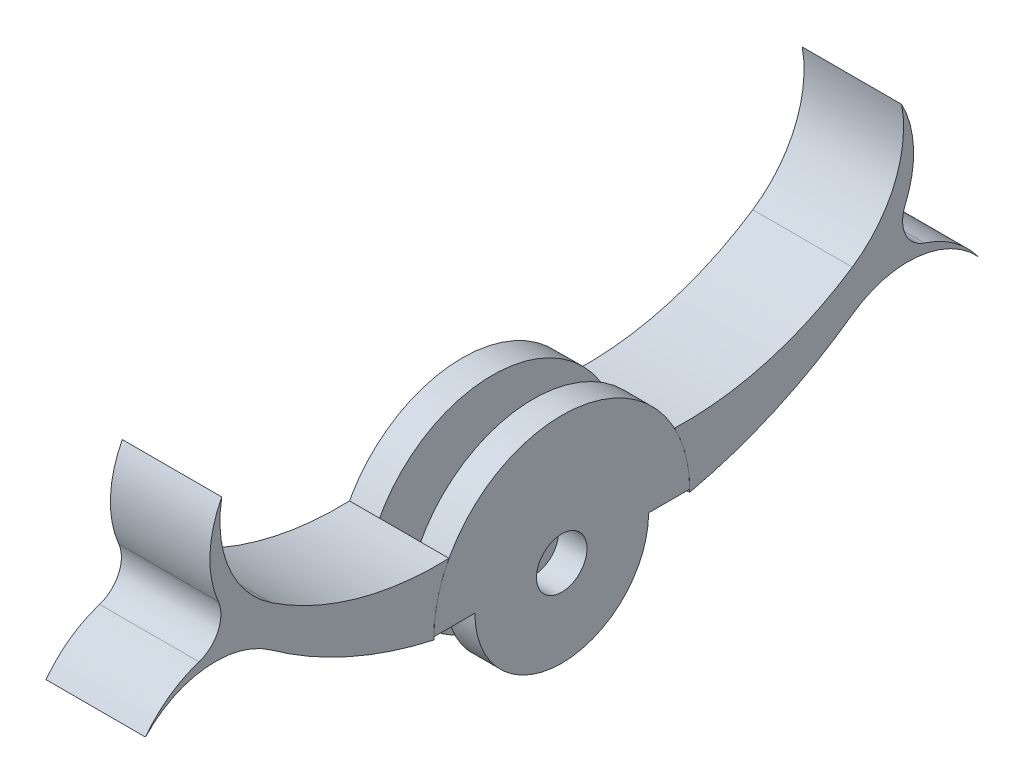
ISO-10303-21;
HEADER;
FILE_DESCRIPTION(('STEP AP214'),'2;1');
FILE_NAME('part.step','',(''),(''),'','','');
FILE_SCHEMA(('AUTOMOTIVE_DESIGN { 1 0 10303 214 1 1 1 1 }'));
ENDSEC;
DATA;
#1=APPLICATION_CONTEXT('core data for automotive mechanical design processes');
#2=APPLICATION_PROTOCOL_DEFINITION('international standard','automotive_design',2000,#1);
#3=PRODUCT_CONTEXT('',#1,'mechanical');
#4=PRODUCT('Part','Part','',(#3));
#5=PRODUCT_RELATED_PRODUCT_CATEGORY('part','',(#4));
#6=PRODUCT_DEFINITION_FORMATION('','',#4);
#7=PRODUCT_DEFINITION_CONTEXT('part definition',#1,'design');
#8=PRODUCT_DEFINITION('design','',#6,#7);
#9=PRODUCT_DEFINITION_SHAPE('','',#8);
#10=(LENGTH_UNIT() NAMED_UNIT(*) SI_UNIT(.MILLI.,.METRE.));
#11=(NAMED_UNIT(*) PLANE_ANGLE_UNIT() SI_UNIT($,.RADIAN.));
#12=(NAMED_UNIT(*) SI_UNIT($,.STERADIAN.) SOLID_ANGLE_UNIT());
#13=UNCERTAINTY_MEASURE_WITH_UNIT(LENGTH_MEASURE(1.E-05),#10,'distance_accuracy_value','');
#14=(GEOMETRIC_REPRESENTATION_CONTEXT(3) GLOBAL_UNCERTAINTY_ASSIGNED_CONTEXT((#13)) GLOBAL_UNIT_ASSIGNED_CONTEXT((#10,
#11,#12)) REPRESENTATION_CONTEXT('',''));
#15=CARTESIAN_POINT('',(0.,0.,0.));
#16=DIRECTION('',(0.,0.,1.));
#17=DIRECTION('',(1.,0.,0.));
#18=AXIS2_PLACEMENT_3D('',#15,#16,#17);
#19=CARTESIAN_POINT('',(8.001,0.,0.));
#20=DIRECTION('',(1.,0.,0.));
#21=DIRECTION('',(0.,0.,1.));
#22=AXIS2_PLACEMENT_3D('',#19,#20,#21);
#23=PLANE('',#22);
#24=CARTESIAN_POINT('',(8.001,34.5934679798672,-2.58194272139042));
#25=DIRECTION('',(-1.,0.,0.));
#26=DIRECTION('',(0.,0.,1.));
#27=AXIS2_PLACEMENT_3D('',#24,#25,#26);
#28=CIRCLE('',#27,35.6553535156911);
#29=CARTESIAN_POINT('',(8.001,-0.219928201198768,-10.2846487828373));
#30=VERTEX_POINT('',#29);
#31=CARTESIAN_POINT('',(8.001,5.62207179880123,-23.3656487828373));
#32=VERTEX_POINT('',#31);
#33=EDGE_CURVE('E51',#30,#32,#28,.F.);
#34=ORIENTED_EDGE('',*,*,#33,.T.);
#35=CARTESIAN_POINT('',(8.001,-0.627053130674843,-27.848690430667));
#36=DIRECTION('',(-1.,0.,0.));
#37=DIRECTION('',(0.,0.,1.));
#38=AXIS2_PLACEMENT_3D('',#35,#36,#37);
#39=CIRCLE('',#38,7.69085332069039);
#40=CARTESIAN_POINT('',(8.001,4.61567464330049,-33.475681659411));
#41=VERTEX_POINT('',#40);
#42=EDGE_CURVE('E114',#32,#41,#39,.T.);
#43=ORIENTED_EDGE('',*,*,#42,.T.);
#44=CARTESIAN_POINT('',(8.001,-0.558812525632776,-26.5026890564416));
#45=DIRECTION('',(-1.,0.,0.));
#46=DIRECTION('',(0.,0.,1.));
#47=AXIS2_PLACEMENT_3D('',#44,#45,#46);
#48=CIRCLE('',#47,8.68319890953337);
#49=CARTESIAN_POINT('',(8.001,7.70415506120035,-29.1712673223852));
#50=VERTEX_POINT('',#49);
#51=EDGE_CURVE('E112',#41,#50,#48,.F.);
#52=ORIENTED_EDGE('',*,*,#51,.T.);
#53=CARTESIAN_POINT('',(8.001,10.1212294469447,-29.9518769647665));
#54=DIRECTION('',(-1.,0.,0.));
#55=DIRECTION('',(0.,0.,1.));
#56=AXIS2_PLACEMENT_3D('',#53,#54,#55);
#57=CIRCLE('',#56,2.54);
#58=CARTESIAN_POINT('',(8.001,11.1275475547437,-27.6197269125795));
#59=VERTEX_POINT('',#58);
#60=EDGE_CURVE('E151',#50,#59,#57,.T.);
#61=ORIENTED_EDGE('',*,*,#60,.T.);
#62=CARTESIAN_POINT('',(8.001,14.4101946702873,-20.0121666565386));
#63=DIRECTION('',(-1.,0.,0.));
#64=DIRECTION('',(0.,0.,1.));
#65=AXIS2_PLACEMENT_3D('',#62,#63,#64);
#66=CIRCLE('',#65,8.28557452048316);
#67=CARTESIAN_POINT('',(8.001,18.2736984419772,-27.3418381185222));
#68=VERTEX_POINT('',#67);
#69=EDGE_CURVE('E147',#59,#68,#66,.F.);
#70=ORIENTED_EDGE('',*,*,#69,.T.);
#71=CARTESIAN_POINT('',(8.001,16.6298694438391,-18.2266754483472));
#72=DIRECTION('',(-1.,0.,0.));
#73=DIRECTION('',(0.,0.,1.));
#74=AXIS2_PLACEMENT_3D('',#71,#72,#73);
#75=CIRCLE('',#74,9.26220083343437);
#76=CARTESIAN_POINT('',(8.001,8.92407179880123,-23.3656487828373));
#77=VERTEX_POINT('',#76);
#78=EDGE_CURVE('E143',#68,#77,#75,.T.);
#79=ORIENTED_EDGE('',*,*,#78,.T.);
#80=CARTESIAN_POINT('',(8.001,29.115893095207,-9.89978372942019));
#81=DIRECTION('',(-1.,0.,0.));
#82=DIRECTION('',(0.,0.,1.));
#83=AXIS2_PLACEMENT_3D('',#80,#81,#82);
#84=CIRCLE('',#83,24.27012914887);
#85=CARTESIAN_POINT('',(8.001,4.86007179880123,-9.06653578333517));
#86=VERTEX_POINT('',#85);
#87=EDGE_CURVE('E139',#77,#86,#84,.T.);
#88=ORIENTED_EDGE('',*,*,#87,.T.);
#89=CARTESIAN_POINT('',(8.001,-9.88358700437786E-13,4.13384604325273E-12));
#90=DIRECTION('',(-1.,0.,0.));
#91=DIRECTION('',(0.,0.,1.));
#92=AXIS2_PLACEMENT_3D('',#89,#90,#91);
#93=CIRCLE('',#92,10.2870000000041);
#94=EDGE_CURVE('E136',#86,#30,#93,.T.);
#95=ORIENTED_EDGE('',*,*,#94,.T.);
#96=EDGE_LOOP('',(#34,#43,#52,#61,#70,#79,#88,#95));
#97=FACE_BOUND('',#96,.T.);
#98=ADVANCED_FACE('F43',(#97),#23,.T.);
#99=CARTESIAN_POINT('',(0.,16.9832074245962,-15.2153165760287));
#100=DIRECTION('',(-1.,0.,0.));
#101=DIRECTION('',(0.,0.,-1.));
#102=AXIS2_PLACEMENT_3D('',#99,#100,#101);
#103=PLANE('',#102);
#104=CARTESIAN_POINT('',(0.,34.5934679798672,-2.58194272139042));
#105=DIRECTION('',(1.,0.,0.));
#106=DIRECTION('',(0.,0.,-1.));
#107=AXIS2_PLACEMENT_3D('',#104,#105,#106);
#108=CIRCLE('',#107,35.6553535156911);
#109=CARTESIAN_POINT('',(0.,-0.219928201198768,-10.2846487828373));
#110=VERTEX_POINT('',#109);
#111=CARTESIAN_POINT('',(0.,5.62207179880123,-23.3656487828373));
#112=VERTEX_POINT('',#111);
#113=EDGE_CURVE('E120',#110,#112,#108,.T.);
#114=ORIENTED_EDGE('',*,*,#113,.F.);
#115=CARTESIAN_POINT('',(0.,-9.88358700437786E-13,4.13384604325273E-12));
#116=DIRECTION('',(-1.,0.,0.));
#117=DIRECTION('',(0.,0.,1.));
#118=AXIS2_PLACEMENT_3D('',#115,#116,#117);
#119=CIRCLE('',#118,10.2870000000041);
#120=CARTESIAN_POINT('',(0.,4.86007179880123,-9.06653578333517));
#121=VERTEX_POINT('',#120);
#122=EDGE_CURVE('E132',#121,#110,#119,.T.);
#123=ORIENTED_EDGE('',*,*,#122,.F.);
#124=CARTESIAN_POINT('',(0.,29.115893095207,-9.89978372942019));
#125=DIRECTION('',(-1.,0.,0.));
#126=DIRECTION('',(0.,0.,-1.));
#127=AXIS2_PLACEMENT_3D('',#124,#125,#126);
#128=CIRCLE('',#127,24.27012914887);
#129=CARTESIAN_POINT('',(0.,8.92407179880123,-23.3656487828373));
#130=VERTEX_POINT('',#129);
#131=EDGE_CURVE('E170',#130,#121,#128,.T.);
#132=ORIENTED_EDGE('',*,*,#131,.F.);
#133=CARTESIAN_POINT('',(0.,16.6298694438391,-18.2266754483472));
#134=DIRECTION('',(-1.,0.,0.));
#135=DIRECTION('',(0.,0.,-1.));
#136=AXIS2_PLACEMENT_3D('',#133,#134,#135);
#137=CIRCLE('',#136,9.26220083343437);
#138=CARTESIAN_POINT('',(0.,18.2736984419772,-27.3418381185222));
#139=VERTEX_POINT('',#138);
#140=EDGE_CURVE('E169',#139,#130,#137,.T.);
#141=ORIENTED_EDGE('',*,*,#140,.F.);
#142=CARTESIAN_POINT('',(0.,14.4101946702873,-20.0121666565386));
#143=DIRECTION('',(1.,0.,0.));
#144=DIRECTION('',(0.,0.,1.));
#145=AXIS2_PLACEMENT_3D('',#142,#143,#144);
#146=CIRCLE('',#145,8.28557452048316);
#147=CARTESIAN_POINT('',(0.,11.1275475547437,-27.6197269125795));
#148=VERTEX_POINT('',#147);
#149=EDGE_CURVE('E126',#148,#139,#146,.T.);
#150=ORIENTED_EDGE('',*,*,#149,.F.);
#151=CARTESIAN_POINT('',(0.,10.1212294469447,-29.9518769647665));
#152=DIRECTION('',(-1.,0.,0.));
#153=DIRECTION('',(0.,0.,-1.));
#154=AXIS2_PLACEMENT_3D('',#151,#152,#153);
#155=CIRCLE('',#154,2.54);
#156=CARTESIAN_POINT('',(0.,7.70415506120035,-29.1712673223852));
#157=VERTEX_POINT('',#156);
#158=EDGE_CURVE('E124',#157,#148,#155,.T.);
#159=ORIENTED_EDGE('',*,*,#158,.F.);
#160=CARTESIAN_POINT('',(0.,-0.558812525632776,-26.5026890564416));
#161=DIRECTION('',(1.,0.,0.));
#162=DIRECTION('',(0.,0.,-1.));
#163=AXIS2_PLACEMENT_3D('',#160,#161,#162);
#164=CIRCLE('',#163,8.68319890953337);
#165=CARTESIAN_POINT('',(0.,4.61567464330049,-33.475681659411));
#166=VERTEX_POINT('',#165);
#167=EDGE_CURVE('E109',#166,#157,#164,.T.);
#168=ORIENTED_EDGE('',*,*,#167,.F.);
#169=CARTESIAN_POINT('',(0.,-0.627053130674843,-27.848690430667));
#170=DIRECTION('',(-1.,0.,0.));
#171=DIRECTION('',(0.,0.,1.));
#172=AXIS2_PLACEMENT_3D('',#169,#170,#171);
#173=CIRCLE('',#172,7.69085332069039);
#174=EDGE_CURVE('E115',#112,#166,#173,.T.);
#175=ORIENTED_EDGE('',*,*,#174,.F.);
#176=EDGE_LOOP('',(#114,#123,#132,#141,#150,#159,#168,#175));
#177=FACE_BOUND('',#176,.T.);
#178=ADVANCED_FACE('F122',(#177),#103,.T.);
#179=CARTESIAN_POINT('',(38.6248571838483,-0.627053130674843,-27.848690430667));
#180=DIRECTION('',(-1.,0.,0.));
#181=DIRECTION('',(0.,0.,-1.));
#182=AXIS2_PLACEMENT_3D('',#179,#180,#181);
#183=CYLINDRICAL_SURFACE('',#182,7.69085332069039);
#184=DIRECTION('',(-1.,0.,0.));
#185=VECTOR('',#184,1.);
#186=CARTESIAN_POINT('',(38.6248571838483,5.62207179880123,-23.3656487828373));
#187=LINE('',#186,#185);
#188=EDGE_CURVE('E12',#32,#112,#187,.T.);
#189=ORIENTED_EDGE('',*,*,#188,.T.);
#190=ORIENTED_EDGE('',*,*,#174,.T.);
#191=DIRECTION('',(-1.,0.,0.));
#192=VECTOR('',#191,1.);
#193=CARTESIAN_POINT('',(38.6248571838483,4.61567464330049,-33.475681659411));
#194=LINE('',#193,#192);
#195=EDGE_CURVE('E92',#41,#166,#194,.T.);
#196=ORIENTED_EDGE('',*,*,#195,.F.);
#197=ORIENTED_EDGE('',*,*,#42,.F.);
#198=EDGE_LOOP('',(#189,#190,#196,#197));
#199=FACE_BOUND('',#198,.T.);
#200=ADVANCED_FACE('F116',(#199),#183,.F.);
#201=CARTESIAN_POINT('',(38.6248571838483,-0.558812525632776,-26.5026890564416));
#202=DIRECTION('',(-1.,0.,0.));
#203=DIRECTION('',(0.,0.,-1.));
#204=AXIS2_PLACEMENT_3D('',#201,#202,#203);
#205=CYLINDRICAL_SURFACE('',#204,8.68319890953337);
#206=ORIENTED_EDGE('',*,*,#195,.T.);
#207=ORIENTED_EDGE('',*,*,#167,.T.);
#208=DIRECTION('',(-1.,0.,0.));
#209=VECTOR('',#208,1.);
#210=CARTESIAN_POINT('',(38.6248571838483,7.70415506120035,-29.1712673223852));
#211=LINE('',#210,#209);
#212=EDGE_CURVE('E87',#50,#157,#211,.T.);
#213=ORIENTED_EDGE('',*,*,#212,.F.);
#214=ORIENTED_EDGE('',*,*,#51,.F.);
#215=EDGE_LOOP('',(#206,#207,#213,#214));
#216=FACE_BOUND('',#215,.T.);
#217=ADVANCED_FACE('F107',(#216),#205,.T.);
#218=CARTESIAN_POINT('',(38.6248571838483,10.1212294469447,-29.9518769647665));
#219=DIRECTION('',(-1.,0.,0.));
#220=DIRECTION('',(0.,0.,-1.));
#221=AXIS2_PLACEMENT_3D('',#218,#219,#220);
#222=CYLINDRICAL_SURFACE('',#221,2.54);
#223=ORIENTED_EDGE('',*,*,#212,.T.);
#224=ORIENTED_EDGE('',*,*,#158,.T.);
#225=DIRECTION('',(-1.,0.,0.));
#226=VECTOR('',#225,1.);
#227=CARTESIAN_POINT('',(38.6248571838483,11.1275475547437,-27.6197269125795));
#228=LINE('',#227,#226);
#229=EDGE_CURVE('E150',#59,#148,#228,.T.);
#230=ORIENTED_EDGE('',*,*,#229,.F.);
#231=ORIENTED_EDGE('',*,*,#60,.F.);
#232=EDGE_LOOP('',(#223,#224,#230,#231));
#233=FACE_BOUND('',#232,.T.);
#234=ADVANCED_FACE('F166',(#233),#222,.F.);
#235=CARTESIAN_POINT('',(38.6248571838483,14.4101946702873,-20.0121666565386));
#236=DIRECTION('',(-1.,0.,0.));
#237=DIRECTION('',(0.,0.,-1.));
#238=AXIS2_PLACEMENT_3D('',#235,#236,#237);
#239=CYLINDRICAL_SURFACE('',#238,8.28557452048316);
#240=ORIENTED_EDGE('',*,*,#229,.T.);
#241=ORIENTED_EDGE('',*,*,#149,.T.);
#242=DIRECTION('',(-1.,0.,0.));
#243=VECTOR('',#242,1.);
#244=CARTESIAN_POINT('',(38.6248571838483,18.2736984419772,-27.3418381185222));
#245=LINE('',#244,#243);
#246=EDGE_CURVE('E146',#68,#139,#245,.T.);
#247=ORIENTED_EDGE('',*,*,#246,.F.);
#248=ORIENTED_EDGE('',*,*,#69,.F.);
#249=EDGE_LOOP('',(#240,#241,#247,#248));
#250=FACE_BOUND('',#249,.T.);
#251=ADVANCED_FACE('F164',(#250),#239,.T.);
#252=CARTESIAN_POINT('',(38.6248571838483,16.6298694438391,-18.2266754483472));
#253=DIRECTION('',(-1.,0.,0.));
#254=DIRECTION('',(0.,0.,-1.));
#255=AXIS2_PLACEMENT_3D('',#252,#253,#254);
#256=CYLINDRICAL_SURFACE('',#255,9.26220083343437);
#257=ORIENTED_EDGE('',*,*,#246,.T.);
#258=ORIENTED_EDGE('',*,*,#140,.T.);
#259=DIRECTION('',(-1.,0.,0.));
#260=VECTOR('',#259,1.);
#261=CARTESIAN_POINT('',(38.6248571838483,8.92407179880123,-23.3656487828373));
#262=LINE('',#261,#260);
#263=EDGE_CURVE('E142',#77,#130,#262,.T.);
#264=ORIENTED_EDGE('',*,*,#263,.F.);
#265=ORIENTED_EDGE('',*,*,#78,.F.);
#266=EDGE_LOOP('',(#257,#258,#264,#265));
#267=FACE_BOUND('',#266,.T.);
#268=ADVANCED_FACE('F189',(#267),#256,.F.);
#269=CARTESIAN_POINT('',(38.6248571838483,29.115893095207,-9.89978372942019));
#270=DIRECTION('',(-1.,0.,0.));
#271=DIRECTION('',(0.,0.,-1.));
#272=AXIS2_PLACEMENT_3D('',#269,#270,#271);
#273=CYLINDRICAL_SURFACE('',#272,24.27012914887);
#274=ORIENTED_EDGE('',*,*,#263,.T.);
#275=ORIENTED_EDGE('',*,*,#131,.T.);
#276=DIRECTION('',(-1.,0.,0.));
#277=VECTOR('',#276,1.);
#278=CARTESIAN_POINT('',(38.6248571838483,4.86007179880123,-9.06653578333517));
#279=LINE('',#278,#277);
#280=EDGE_CURVE('E138',#86,#121,#279,.T.);
#281=ORIENTED_EDGE('',*,*,#280,.F.);
#282=ORIENTED_EDGE('',*,*,#87,.F.);
#283=EDGE_LOOP('',(#274,#275,#281,#282));
#284=FACE_BOUND('',#283,.T.);
#285=ADVANCED_FACE('F187',(#284),#273,.F.);
#286=CARTESIAN_POINT('',(38.6248571838483,-9.88358700437786E-13,4.13384604325273E-12));
#287=DIRECTION('',(-1.,0.,0.));
#288=DIRECTION('',(0.,0.,-1.));
#289=AXIS2_PLACEMENT_3D('',#286,#287,#288);
#290=CYLINDRICAL_SURFACE('',#289,10.2870000000041);
#291=ORIENTED_EDGE('',*,*,#122,.T.);
#292=DIRECTION('',(-1.,0.,0.));
#293=VECTOR('',#292,1.);
#294=CARTESIAN_POINT('',(38.6248571838483,-0.219928201198768,-10.2846487828373));
#295=LINE('',#294,#293);
#296=EDGE_CURVE('E135',#30,#110,#295,.T.);
#297=ORIENTED_EDGE('',*,*,#296,.F.);
#298=ORIENTED_EDGE('',*,*,#94,.F.);
#299=ORIENTED_EDGE('',*,*,#280,.T.);
#300=EDGE_LOOP('',(#291,#297,#298,#299));
#301=FACE_BOUND('',#300,.T.);
#302=ADVANCED_FACE('F178',(#301),#290,.F.);
#303=CARTESIAN_POINT('',(38.6248571838483,34.5934679798672,-2.58194272139042));
#304=DIRECTION('',(-1.,0.,0.));
#305=DIRECTION('',(0.,0.,-1.));
#306=AXIS2_PLACEMENT_3D('',#303,#304,#305);
#307=CYLINDRICAL_SURFACE('',#306,35.6553535156911);
#308=ORIENTED_EDGE('',*,*,#296,.T.);
#309=ORIENTED_EDGE('',*,*,#113,.T.);
#310=ORIENTED_EDGE('',*,*,#188,.F.);
#311=ORIENTED_EDGE('',*,*,#33,.F.);
#312=EDGE_LOOP('',(#308,#309,#310,#311));
#313=FACE_BOUND('',#312,.T.);
#314=ADVANCED_FACE('F182',(#313),#307,.T.);
#315=CLOSED_SHELL('',(#98,#178,#200,#217,#234,#251,#268,#285,#302,#314));
#316=MANIFOLD_SOLID_BREP('B2',#315);
#317=CARTESIAN_POINT('',(8.001,0.,0.));
#318=DIRECTION('',(1.,0.,0.));
#319=DIRECTION('',(0.,0.,-1.));
#320=AXIS2_PLACEMENT_3D('',#317,#318,#319);
#321=PLANE('',#320);
#322=CARTESIAN_POINT('',(8.001,34.5934679798672,2.58194272139042));
#323=DIRECTION('',(1.,0.,0.));
#324=DIRECTION('',(0.,0.,-1.));
#325=AXIS2_PLACEMENT_3D('',#322,#323,#324);
#326=CIRCLE('',#325,35.6553535156911);
#327=CARTESIAN_POINT('',(8.001,-0.219928201198768,10.2846487828373));
#328=VERTEX_POINT('',#327);
#329=CARTESIAN_POINT('',(8.001,5.62207179880123,23.3656487828373));
#330=VERTEX_POINT('',#329);
#331=EDGE_CURVE('E281',#328,#330,#326,.F.);
#332=ORIENTED_EDGE('',*,*,#331,.F.);
#333=CARTESIAN_POINT('',(8.001,-9.88358700437786E-13,-4.13384604325273E-12));
#334=DIRECTION('',(1.,0.,0.));
#335=DIRECTION('',(0.,0.,-1.));
#336=AXIS2_PLACEMENT_3D('',#333,#334,#335);
#337=CIRCLE('',#336,10.2870000000041);
#338=CARTESIAN_POINT('',(8.001,4.86007179880123,9.06653578333517));
#339=VERTEX_POINT('',#338);
#340=EDGE_CURVE('E366',#339,#328,#337,.T.);
#341=ORIENTED_EDGE('',*,*,#340,.F.);
#342=CARTESIAN_POINT('',(8.001,29.115893095207,9.89978372942019));
#343=DIRECTION('',(1.,0.,0.));
#344=DIRECTION('',(0.,0.,-1.));
#345=AXIS2_PLACEMENT_3D('',#342,#343,#344);
#346=CIRCLE('',#345,24.27012914887);
#347=CARTESIAN_POINT('',(8.001,8.92407179880123,23.3656487828373));
#348=VERTEX_POINT('',#347);
#349=EDGE_CURVE('E369',#348,#339,#346,.T.);
#350=ORIENTED_EDGE('',*,*,#349,.F.);
#351=CARTESIAN_POINT('',(8.001,16.6298694438391,18.2266754483472));
#352=DIRECTION('',(1.,0.,0.));
#353=DIRECTION('',(0.,0.,-1.));
#354=AXIS2_PLACEMENT_3D('',#351,#352,#353);
#355=CIRCLE('',#354,9.26220083343437);
#356=CARTESIAN_POINT('',(8.001,18.2736984419772,27.3418381185222));
#357=VERTEX_POINT('',#356);
#358=EDGE_CURVE('E373',#357,#348,#355,.T.);
#359=ORIENTED_EDGE('',*,*,#358,.F.);
#360=CARTESIAN_POINT('',(8.001,14.4101946702873,20.0121666565386));
#361=DIRECTION('',(1.,0.,0.));
#362=DIRECTION('',(0.,0.,-1.));
#363=AXIS2_PLACEMENT_3D('',#360,#361,#362);
#364=CIRCLE('',#363,8.28557452048316);
#365=CARTESIAN_POINT('',(8.001,11.1275475547437,27.6197269125795));
#366=VERTEX_POINT('',#365);
#367=EDGE_CURVE('E377',#366,#357,#364,.F.);
#368=ORIENTED_EDGE('',*,*,#367,.F.);
#369=CARTESIAN_POINT('',(8.001,10.1212294469447,29.9518769647665));
#370=DIRECTION('',(1.,0.,0.));
#371=DIRECTION('',(0.,0.,-1.));
#372=AXIS2_PLACEMENT_3D('',#369,#370,#371);
#373=CIRCLE('',#372,2.54);
#374=CARTESIAN_POINT('',(8.001,7.70415506120035,29.1712673223852));
#375=VERTEX_POINT('',#374);
#376=EDGE_CURVE('E316',#375,#366,#373,.T.);
#377=ORIENTED_EDGE('',*,*,#376,.F.);
#378=CARTESIAN_POINT('',(8.001,-0.558812525632776,26.5026890564416));
#379=DIRECTION('',(1.,0.,0.));
#380=DIRECTION('',(0.,0.,-1.));
#381=AXIS2_PLACEMENT_3D('',#378,#379,#380);
#382=CIRCLE('',#381,8.68319890953337);
#383=CARTESIAN_POINT('',(8.001,4.61567464330049,33.475681659411));
#384=VERTEX_POINT('',#383);
#385=EDGE_CURVE('E321',#384,#375,#382,.F.);
#386=ORIENTED_EDGE('',*,*,#385,.F.);
#387=CARTESIAN_POINT('',(8.001,-0.627053130674843,27.848690430667));
#388=DIRECTION('',(1.,0.,0.));
#389=DIRECTION('',(0.,0.,-1.));
#390=AXIS2_PLACEMENT_3D('',#387,#388,#389);
#391=CIRCLE('',#390,7.69085332069039);
#392=EDGE_CURVE('E348',#330,#384,#391,.T.);
#393=ORIENTED_EDGE('',*,*,#392,.F.);
#394=EDGE_LOOP('',(#332,#341,#350,#359,#368,#377,#386,#393));
#395=FACE_BOUND('',#394,.T.);
#396=ADVANCED_FACE('F273',(#395),#321,.T.);
#397=CARTESIAN_POINT('',(0.,16.9832074245962,15.2153165760287));
#398=DIRECTION('',(-1.,0.,0.));
#399=DIRECTION('',(0.,0.,1.));
#400=AXIS2_PLACEMENT_3D('',#397,#398,#399);
#401=PLANE('',#400);
#402=CARTESIAN_POINT('',(0.,34.5934679798672,2.58194272139042));
#403=DIRECTION('',(-1.,0.,0.));
#404=DIRECTION('',(0.,0.,1.));
#405=AXIS2_PLACEMENT_3D('',#402,#403,#404);
#406=CIRCLE('',#405,35.6553535156911);
#407=CARTESIAN_POINT('',(0.,-0.219928201198768,10.2846487828373));
#408=VERTEX_POINT('',#407);
#409=CARTESIAN_POINT('',(0.,5.62207179880123,23.3656487828373));
#410=VERTEX_POINT('',#409);
#411=EDGE_CURVE('E357',#408,#410,#406,.T.);
#412=ORIENTED_EDGE('',*,*,#411,.T.);
#413=CARTESIAN_POINT('',(0.,-0.627053130674843,27.848690430667));
#414=DIRECTION('',(1.,0.,0.));
#415=DIRECTION('',(0.,0.,-1.));
#416=AXIS2_PLACEMENT_3D('',#413,#414,#415);
#417=CIRCLE('',#416,7.69085332069039);
#418=CARTESIAN_POINT('',(0.,4.61567464330049,33.475681659411));
#419=VERTEX_POINT('',#418);
#420=EDGE_CURVE('E346',#410,#419,#417,.T.);
#421=ORIENTED_EDGE('',*,*,#420,.T.);
#422=CARTESIAN_POINT('',(0.,-0.558812525632776,26.5026890564416));
#423=DIRECTION('',(-1.,0.,0.));
#424=DIRECTION('',(0.,0.,1.));
#425=AXIS2_PLACEMENT_3D('',#422,#423,#424);
#426=CIRCLE('',#425,8.68319890953337);
#427=CARTESIAN_POINT('',(0.,7.70415506120035,29.1712673223852));
#428=VERTEX_POINT('',#427);
#429=EDGE_CURVE('E350',#419,#428,#426,.T.);
#430=ORIENTED_EDGE('',*,*,#429,.T.);
#431=CARTESIAN_POINT('',(0.,10.1212294469447,29.9518769647665));
#432=DIRECTION('',(1.,0.,0.));
#433=DIRECTION('',(0.,0.,1.));
#434=AXIS2_PLACEMENT_3D('',#431,#432,#433);
#435=CIRCLE('',#434,2.54);
#436=CARTESIAN_POINT('',(0.,11.1275475547437,27.6197269125795));
#437=VERTEX_POINT('',#436);
#438=EDGE_CURVE('E354',#428,#437,#435,.T.);
#439=ORIENTED_EDGE('',*,*,#438,.T.);
#440=CARTESIAN_POINT('',(0.,14.4101946702873,20.0121666565386));
#441=DIRECTION('',(-1.,0.,0.));
#442=DIRECTION('',(0.,0.,-1.));
#443=AXIS2_PLACEMENT_3D('',#440,#441,#442);
#444=CIRCLE('',#443,8.28557452048316);
#445=CARTESIAN_POINT('',(0.,18.2736984419772,27.3418381185222));
#446=VERTEX_POINT('',#445);
#447=EDGE_CURVE('E395',#437,#446,#444,.T.);
#448=ORIENTED_EDGE('',*,*,#447,.T.);
#449=CARTESIAN_POINT('',(0.,16.6298694438391,18.2266754483472));
#450=DIRECTION('',(1.,0.,0.));
#451=DIRECTION('',(0.,0.,1.));
#452=AXIS2_PLACEMENT_3D('',#449,#450,#451);
#453=CIRCLE('',#452,9.26220083343437);
#454=CARTESIAN_POINT('',(0.,8.92407179880123,23.3656487828373));
#455=VERTEX_POINT('',#454);
#456=EDGE_CURVE('E400',#446,#455,#453,.T.);
#457=ORIENTED_EDGE('',*,*,#456,.T.);
#458=CARTESIAN_POINT('',(0.,29.115893095207,9.89978372942019));
#459=DIRECTION('',(1.,0.,0.));
#460=DIRECTION('',(0.,0.,1.));
#461=AXIS2_PLACEMENT_3D('',#458,#459,#460);
#462=CIRCLE('',#461,24.27012914887);
#463=CARTESIAN_POINT('',(0.,4.86007179880123,9.06653578333517));
#464=VERTEX_POINT('',#463);
#465=EDGE_CURVE('E404',#455,#464,#462,.T.);
#466=ORIENTED_EDGE('',*,*,#465,.T.);
#467=CARTESIAN_POINT('',(0.,-9.88358700437786E-13,-4.13384604325273E-12));
#468=DIRECTION('',(1.,0.,0.));
#469=DIRECTION('',(0.,0.,-1.));
#470=AXIS2_PLACEMENT_3D('',#467,#468,#469);
#471=CIRCLE('',#470,10.2870000000041);
#472=EDGE_CURVE('E363',#464,#408,#471,.T.);
#473=ORIENTED_EDGE('',*,*,#472,.T.);
#474=EDGE_LOOP('',(#412,#421,#430,#439,#448,#457,#466,#473));
#475=FACE_BOUND('',#474,.T.);
#476=ADVANCED_FACE('F356',(#475),#401,.T.);
#477=CARTESIAN_POINT('',(38.6248571838483,-0.627053130674843,27.848690430667));
#478=DIRECTION('',(-1.,0.,0.));
#479=DIRECTION('',(0.,0.,1.));
#480=AXIS2_PLACEMENT_3D('',#477,#478,#479);
#481=CYLINDRICAL_SURFACE('',#480,7.69085332069039);
#482=DIRECTION('',(-1.,0.,0.));
#483=VECTOR('',#482,1.);
#484=CARTESIAN_POINT('',(38.6248571838483,5.62207179880123,23.3656487828373));
#485=LINE('',#484,#483);
#486=EDGE_CURVE('E41',#330,#410,#485,.T.);
#487=ORIENTED_EDGE('',*,*,#486,.F.);
#488=ORIENTED_EDGE('',*,*,#392,.T.);
#489=DIRECTION('',(-1.,0.,0.));
#490=VECTOR('',#489,1.);
#491=CARTESIAN_POINT('',(38.6248571838483,4.61567464330049,33.475681659411));
#492=LINE('',#491,#490);
#493=EDGE_CURVE('E343',#384,#419,#492,.T.);
#494=ORIENTED_EDGE('',*,*,#493,.T.);
#495=ORIENTED_EDGE('',*,*,#420,.F.);
#496=EDGE_LOOP('',(#487,#488,#494,#495));
#497=FACE_BOUND('',#496,.T.);
#498=ADVANCED_FACE('F344',(#497),#481,.F.);
#499=CARTESIAN_POINT('',(38.6248571838483,-0.558812525632776,26.5026890564416));
#500=DIRECTION('',(-1.,0.,0.));
#501=DIRECTION('',(0.,0.,1.));
#502=AXIS2_PLACEMENT_3D('',#499,#500,#501);
#503=CYLINDRICAL_SURFACE('',#502,8.68319890953337);
#504=ORIENTED_EDGE('',*,*,#493,.F.);
#505=ORIENTED_EDGE('',*,*,#385,.T.);
#506=DIRECTION('',(-1.,0.,0.));
#507=VECTOR('',#506,1.);
#508=CARTESIAN_POINT('',(38.6248571838483,7.70415506120035,29.1712673223852));
#509=LINE('',#508,#507);
#510=EDGE_CURVE('E338',#375,#428,#509,.T.);
#511=ORIENTED_EDGE('',*,*,#510,.T.);
#512=ORIENTED_EDGE('',*,*,#429,.F.);
#513=EDGE_LOOP('',(#504,#505,#511,#512));
#514=FACE_BOUND('',#513,.T.);
#515=ADVANCED_FACE('F351',(#514),#503,.T.);
#516=CARTESIAN_POINT('',(38.6248571838483,10.1212294469447,29.9518769647665));
#517=DIRECTION('',(-1.,0.,0.));
#518=DIRECTION('',(0.,0.,1.));
#519=AXIS2_PLACEMENT_3D('',#516,#517,#518);
#520=CYLINDRICAL_SURFACE('',#519,2.54);
#521=ORIENTED_EDGE('',*,*,#510,.F.);
#522=ORIENTED_EDGE('',*,*,#376,.T.);
#523=DIRECTION('',(-1.,0.,0.));
#524=VECTOR('',#523,1.);
#525=CARTESIAN_POINT('',(38.6248571838483,11.1275475547437,27.6197269125795));
#526=LINE('',#525,#524);
#527=EDGE_CURVE('E380',#366,#437,#526,.T.);
#528=ORIENTED_EDGE('',*,*,#527,.T.);
#529=ORIENTED_EDGE('',*,*,#438,.F.);
#530=EDGE_LOOP('',(#521,#522,#528,#529));
#531=FACE_BOUND('',#530,.T.);
#532=ADVANCED_FACE('F392',(#531),#520,.F.);
#533=CARTESIAN_POINT('',(38.6248571838483,14.4101946702873,20.0121666565386));
#534=DIRECTION('',(-1.,0.,0.));
#535=DIRECTION('',(0.,0.,1.));
#536=AXIS2_PLACEMENT_3D('',#533,#534,#535);
#537=CYLINDRICAL_SURFACE('',#536,8.28557452048316);
#538=ORIENTED_EDGE('',*,*,#527,.F.);
#539=ORIENTED_EDGE('',*,*,#367,.T.);
#540=DIRECTION('',(-1.,0.,0.));
#541=VECTOR('',#540,1.);
#542=CARTESIAN_POINT('',(38.6248571838483,18.2736984419772,27.3418381185222));
#543=LINE('',#542,#541);
#544=EDGE_CURVE('E376',#357,#446,#543,.T.);
#545=ORIENTED_EDGE('',*,*,#544,.T.);
#546=ORIENTED_EDGE('',*,*,#447,.F.);
#547=EDGE_LOOP('',(#538,#539,#545,#546));
#548=FACE_BOUND('',#547,.T.);
#549=ADVANCED_FACE('F396',(#548),#537,.T.);
#550=CARTESIAN_POINT('',(38.6248571838483,16.6298694438391,18.2266754483472));
#551=DIRECTION('',(-1.,0.,0.));
#552=DIRECTION('',(0.,0.,1.));
#553=AXIS2_PLACEMENT_3D('',#550,#551,#552);
#554=CYLINDRICAL_SURFACE('',#553,9.26220083343437);
#555=ORIENTED_EDGE('',*,*,#544,.F.);
#556=ORIENTED_EDGE('',*,*,#358,.T.);
#557=DIRECTION('',(-1.,0.,0.));
#558=VECTOR('',#557,1.);
#559=CARTESIAN_POINT('',(38.6248571838483,8.92407179880123,23.3656487828373));
#560=LINE('',#559,#558);
#561=EDGE_CURVE('E372',#348,#455,#560,.T.);
#562=ORIENTED_EDGE('',*,*,#561,.T.);
#563=ORIENTED_EDGE('',*,*,#456,.F.);
#564=EDGE_LOOP('',(#555,#556,#562,#563));
#565=FACE_BOUND('',#564,.T.);
#566=ADVANCED_FACE('F430',(#565),#554,.F.);
#567=CARTESIAN_POINT('',(38.6248571838483,29.115893095207,9.89978372942019));
#568=DIRECTION('',(-1.,0.,0.));
#569=DIRECTION('',(0.,0.,1.));
#570=AXIS2_PLACEMENT_3D('',#567,#568,#569);
#571=CYLINDRICAL_SURFACE('',#570,24.27012914887);
#572=ORIENTED_EDGE('',*,*,#561,.F.);
#573=ORIENTED_EDGE('',*,*,#349,.T.);
#574=DIRECTION('',(-1.,0.,0.));
#575=VECTOR('',#574,1.);
#576=CARTESIAN_POINT('',(38.6248571838483,4.86007179880123,9.06653578333517));
#577=LINE('',#576,#575);
#578=EDGE_CURVE('E368',#339,#464,#577,.T.);
#579=ORIENTED_EDGE('',*,*,#578,.T.);
#580=ORIENTED_EDGE('',*,*,#465,.F.);
#581=EDGE_LOOP('',(#572,#573,#579,#580));
#582=FACE_BOUND('',#581,.T.);
#583=ADVANCED_FACE('F420',(#582),#571,.F.);
#584=CARTESIAN_POINT('',(38.6248571838483,-9.88358700437786E-13,-4.13384604325273E-12));
#585=DIRECTION('',(-1.,0.,0.));
#586=DIRECTION('',(0.,0.,1.));
#587=AXIS2_PLACEMENT_3D('',#584,#585,#586);
#588=CYLINDRICAL_SURFACE('',#587,10.2870000000041);
#589=ORIENTED_EDGE('',*,*,#340,.T.);
#590=DIRECTION('',(-1.,0.,0.));
#591=VECTOR('',#590,1.);
#592=CARTESIAN_POINT('',(38.6248571838483,-0.219928201198768,10.2846487828373));
#593=LINE('',#592,#591);
#594=EDGE_CURVE('E365',#328,#408,#593,.T.);
#595=ORIENTED_EDGE('',*,*,#594,.T.);
#596=ORIENTED_EDGE('',*,*,#472,.F.);
#597=ORIENTED_EDGE('',*,*,#578,.F.);
#598=EDGE_LOOP('',(#589,#595,#596,#597));
#599=FACE_BOUND('',#598,.T.);
#600=ADVANCED_FACE('F412',(#599),#588,.F.);
#601=CARTESIAN_POINT('',(38.6248571838483,34.5934679798672,2.58194272139042));
#602=DIRECTION('',(-1.,0.,0.));
#603=DIRECTION('',(0.,0.,1.));
#604=AXIS2_PLACEMENT_3D('',#601,#602,#603);
#605=CYLINDRICAL_SURFACE('',#604,35.6553535156911);
#606=ORIENTED_EDGE('',*,*,#594,.F.);
#607=ORIENTED_EDGE('',*,*,#331,.T.);
#608=ORIENTED_EDGE('',*,*,#486,.T.);
#609=ORIENTED_EDGE('',*,*,#411,.F.);
#610=EDGE_LOOP('',(#606,#607,#608,#609));
#611=FACE_BOUND('',#610,.T.);
#612=ADVANCED_FACE('F414',(#611),#605,.T.);
#613=CLOSED_SHELL('',(#396,#476,#498,#515,#532,#549,#566,#583,#600,#612));
#614=MANIFOLD_SOLID_BREP('B6',#613);
#615=CARTESIAN_POINT('',(-23.0024312845404,0.,0.));
#616=DIRECTION('',(1.,0.,0.));
#617=DIRECTION('',(0.,0.,-1.));
#618=AXIS2_PLACEMENT_3D('',#615,#616,#617);
#619=CYLINDRICAL_SURFACE('',#618,6.985);
#620=CARTESIAN_POINT('',(5.715,0.,0.));
#621=DIRECTION('',(1.,0.,0.));
#622=DIRECTION('',(0.,0.,-1.));
#623=AXIS2_PLACEMENT_3D('',#620,#621,#622);
#624=CIRCLE('',#623,6.985);
#625=CARTESIAN_POINT('',(5.715,0.,6.985));
#626=VERTEX_POINT('',#625);
#627=CARTESIAN_POINT('',(5.715,0.,-6.985));
#628=VERTEX_POINT('',#627);
#629=EDGE_CURVE('E647',#626,#628,#624,.T.);
#630=ORIENTED_EDGE('',*,*,#629,.T.);
#631=DIRECTION('',(1.,0.,0.));
#632=VECTOR('',#631,1.);
#633=CARTESIAN_POINT('',(-23.0024312845404,0.,-6.985));
#634=LINE('',#633,#632);
#635=CARTESIAN_POINT('',(8.001,0.,-6.985));
#636=VERTEX_POINT('',#635);
#637=EDGE_CURVE('E612',#628,#636,#634,.T.);
#638=ORIENTED_EDGE('',*,*,#637,.T.);
#639=CARTESIAN_POINT('',(8.001,0.,0.));
#640=DIRECTION('',(-1.,0.,0.));
#641=DIRECTION('',(0.,0.,1.));
#642=AXIS2_PLACEMENT_3D('',#639,#640,#641);
#643=CIRCLE('',#642,6.985);
#644=CARTESIAN_POINT('',(8.001,0.,6.985));
#645=VERTEX_POINT('',#644);
#646=EDGE_CURVE('E622',#636,#645,#643,.T.);
#647=ORIENTED_EDGE('',*,*,#646,.T.);
#648=DIRECTION('',(1.,0.,0.));
#649=VECTOR('',#648,1.);
#650=CARTESIAN_POINT('',(-23.0024312845404,0.,6.985));
#651=LINE('',#650,#649);
#652=EDGE_CURVE('E607',#626,#645,#651,.T.);
#653=ORIENTED_EDGE('',*,*,#652,.F.);
#654=EDGE_LOOP('',(#630,#638,#647,#653));
#655=FACE_BOUND('',#654,.T.);
#656=ADVANCED_FACE('F495',(#655),#619,.T.);
#657=CARTESIAN_POINT('',(8.001,0.,0.));
#658=DIRECTION('',(-1.,0.,0.));
#659=DIRECTION('',(0.,0.,1.));
#660=AXIS2_PLACEMENT_3D('',#657,#658,#659);
#661=CYLINDRICAL_SURFACE('',#660,10.287);
#662=DIRECTION('',(-1.,0.,0.));
#663=VECTOR('',#662,1.);
#664=CARTESIAN_POINT('',(8.00099999999999,2.58544053499593,-9.9568));
#665=LINE('',#664,#663);
#666=CARTESIAN_POINT('',(2.413,2.58544053499593,-9.9568));
#667=VERTEX_POINT('',#666);
#668=CARTESIAN_POINT('',(5.715,2.58544053499594,-9.9568));
#669=VERTEX_POINT('',#668);
#670=EDGE_CURVE('E625',#667,#669,#665,.F.);
#671=ORIENTED_EDGE('',*,*,#670,.T.);
#672=CARTESIAN_POINT('',(5.715,0.,0.));
#673=DIRECTION('',(1.,0.,0.));
#674=DIRECTION('',(0.,0.,-1.));
#675=AXIS2_PLACEMENT_3D('',#672,#673,#674);
#676=CIRCLE('',#675,10.287);
#677=CARTESIAN_POINT('',(5.715,2.58544053499596,9.9568));
#678=VERTEX_POINT('',#677);
#679=EDGE_CURVE('E639',#669,#678,#676,.T.);
#680=ORIENTED_EDGE('',*,*,#679,.T.);
#681=DIRECTION('',(-1.,0.,0.));
#682=VECTOR('',#681,1.);
#683=CARTESIAN_POINT('',(8.001,2.58544053499596,9.9568));
#684=LINE('',#683,#682);
#685=CARTESIAN_POINT('',(2.413,2.58544053499596,9.9568));
#686=VERTEX_POINT('',#685);
#687=EDGE_CURVE('E649',#678,#686,#684,.T.);
#688=ORIENTED_EDGE('',*,*,#687,.T.);
#689=CARTESIAN_POINT('',(2.413,0.,0.));
#690=DIRECTION('',(-1.,0.,0.));
#691=DIRECTION('',(0.,0.,1.));
#692=AXIS2_PLACEMENT_3D('',#689,#690,#691);
#693=CIRCLE('',#692,10.287);
#694=EDGE_CURVE('E583',#686,#667,#693,.T.);
#695=ORIENTED_EDGE('',*,*,#694,.T.);
#696=EDGE_LOOP('',(#671,#680,#688,#695));
#697=FACE_BOUND('',#696,.T.);
#698=CARTESIAN_POINT('',(8.001,0.,0.));
#699=DIRECTION('',(1.,0.,0.));
#700=DIRECTION('',(0.,0.,-1.));
#701=AXIS2_PLACEMENT_3D('',#698,#699,#700);
#702=CIRCLE('',#701,10.287);
#703=CARTESIAN_POINT('',(8.001,0.,-10.287));
#704=VERTEX_POINT('',#703);
#705=CARTESIAN_POINT('',(8.001,0.,10.287));
#706=VERTEX_POINT('',#705);
#707=EDGE_CURVE('E576',#704,#706,#702,.T.);
#708=ORIENTED_EDGE('',*,*,#707,.F.);
#709=DIRECTION('',(1.,0.,0.));
#710=VECTOR('',#709,1.);
#711=CARTESIAN_POINT('',(-23.0024312845404,0.,-10.287));
#712=LINE('',#711,#710);
#713=CARTESIAN_POINT('',(0.,0.,-10.287));
#714=VERTEX_POINT('',#713);
#715=EDGE_CURVE('E610',#714,#704,#712,.T.);
#716=ORIENTED_EDGE('',*,*,#715,.F.);
#717=CARTESIAN_POINT('',(0.,0.,0.));
#718=DIRECTION('',(1.,0.,0.));
#719=DIRECTION('',(0.,0.,-1.));
#720=AXIS2_PLACEMENT_3D('',#717,#718,#719);
#721=CIRCLE('',#720,10.287);
#722=CARTESIAN_POINT('',(0.,0.,10.287));
#723=VERTEX_POINT('',#722);
#724=EDGE_CURVE('E591',#714,#723,#721,.T.);
#725=ORIENTED_EDGE('',*,*,#724,.T.);
#726=DIRECTION('',(1.,0.,0.));
#727=VECTOR('',#726,1.);
#728=CARTESIAN_POINT('',(-23.0024312845404,0.,10.287));
#729=LINE('',#728,#727);
#730=EDGE_CURVE('E606',#723,#706,#729,.T.);
#731=ORIENTED_EDGE('',*,*,#730,.T.);
#732=EDGE_LOOP('',(#708,#716,#725,#731));
#733=FACE_BOUND('',#732,.T.);
#734=ADVANCED_FACE('F497',(#697,#733),#661,.T.);
#735=CARTESIAN_POINT('',(8.001,0.,0.));
#736=DIRECTION('',(1.,0.,0.));
#737=DIRECTION('',(0.,0.,-1.));
#738=AXIS2_PLACEMENT_3D('',#735,#736,#737);
#739=PLANE('',#738);
#740=DIRECTION('',(0.,0.,1.));
#741=VECTOR('',#740,1.);
#742=CARTESIAN_POINT('',(8.001,0.,-6.985));
#743=LINE('',#742,#741);
#744=EDGE_CURVE('E617',#704,#636,#743,.T.);
#745=ORIENTED_EDGE('',*,*,#744,.F.);
#746=ORIENTED_EDGE('',*,*,#707,.T.);
#747=DIRECTION('',(0.,0.,1.));
#748=VECTOR('',#747,1.);
#749=CARTESIAN_POINT('',(8.001,0.,6.985));
#750=LINE('',#749,#748);
#751=EDGE_CURVE('E620',#645,#706,#750,.T.);
#752=ORIENTED_EDGE('',*,*,#751,.F.);
#753=ORIENTED_EDGE('',*,*,#646,.F.);
#754=EDGE_LOOP('',(#745,#746,#752,#753));
#755=FACE_BOUND('',#754,.T.);
#756=CARTESIAN_POINT('',(8.001,0.,0.));
#757=DIRECTION('',(1.,0.,0.));
#758=DIRECTION('',(0.,0.,-1.));
#759=AXIS2_PLACEMENT_3D('',#756,#757,#758);
#760=CIRCLE('',#759,2.032);
#761=CARTESIAN_POINT('',(8.001,0.,-2.032));
#762=VERTEX_POINT('',#761);
#763=EDGE_CURVE('E594',#762,#762,#760,.T.);
#764=ORIENTED_EDGE('',*,*,#763,.F.);
#765=EDGE_LOOP('',(#764));
#766=FACE_BOUND('',#765,.T.);
#767=ADVANCED_FACE('F676',(#755,#766),#739,.T.);
#768=CARTESIAN_POINT('',(0.,0.,0.));
#769=DIRECTION('',(1.,0.,0.));
#770=DIRECTION('',(0.,0.,-1.));
#771=AXIS2_PLACEMENT_3D('',#768,#769,#770);
#772=PLANE('',#771);
#773=CARTESIAN_POINT('',(0.,0.,0.));
#774=DIRECTION('',(-1.,0.,0.));
#775=DIRECTION('',(0.,0.,1.));
#776=AXIS2_PLACEMENT_3D('',#773,#774,#775);
#777=CIRCLE('',#776,2.032);
#778=CARTESIAN_POINT('',(0.,0.,2.032));
#779=VERTEX_POINT('',#778);
#780=EDGE_CURVE('E599',#779,#779,#777,.T.);
#781=ORIENTED_EDGE('',*,*,#780,.F.);
#782=EDGE_LOOP('',(#781));
#783=FACE_BOUND('',#782,.T.);
#784=ORIENTED_EDGE('',*,*,#724,.F.);
#785=DIRECTION('',(0.,0.,-1.));
#786=VECTOR('',#785,1.);
#787=CARTESIAN_POINT('',(0.,0.,-6.985));
#788=LINE('',#787,#786);
#789=CARTESIAN_POINT('',(0.,0.,-6.985));
#790=VERTEX_POINT('',#789);
#791=EDGE_CURVE('E616',#790,#714,#788,.T.);
#792=ORIENTED_EDGE('',*,*,#791,.F.);
#793=CARTESIAN_POINT('',(0.,0.,0.));
#794=DIRECTION('',(1.,0.,0.));
#795=DIRECTION('',(0.,0.,-1.));
#796=AXIS2_PLACEMENT_3D('',#793,#794,#795);
#797=CIRCLE('',#796,6.985);
#798=CARTESIAN_POINT('',(0.,0.,6.985));
#799=VERTEX_POINT('',#798);
#800=EDGE_CURVE('E604',#799,#790,#797,.T.);
#801=ORIENTED_EDGE('',*,*,#800,.F.);
#802=DIRECTION('',(0.,0.,-1.));
#803=VECTOR('',#802,1.);
#804=CARTESIAN_POINT('',(0.,0.,6.985));
#805=LINE('',#804,#803);
#806=EDGE_CURVE('E602',#723,#799,#805,.T.);
#807=ORIENTED_EDGE('',*,*,#806,.F.);
#808=EDGE_LOOP('',(#784,#792,#801,#807));
#809=FACE_BOUND('',#808,.T.);
#810=ADVANCED_FACE('F684',(#783,#809),#772,.F.);
#811=CARTESIAN_POINT('',(4.2672,0.,0.));
#812=DIRECTION('',(1.,0.,0.));
#813=DIRECTION('',(0.,0.,-1.));
#814=AXIS2_PLACEMENT_3D('',#811,#812,#813);
#815=CYLINDRICAL_SURFACE('',#814,2.032);
#816=CARTESIAN_POINT('',(5.715,0.,0.));
#817=DIRECTION('',(1.,0.,0.));
#818=DIRECTION('',(0.,0.,-1.));
#819=AXIS2_PLACEMENT_3D('',#816,#817,#818);
#820=CIRCLE('',#819,2.032);
#821=CARTESIAN_POINT('',(5.715,0.,-2.032));
#822=VERTEX_POINT('',#821);
#823=EDGE_CURVE('E641',#822,#822,#820,.F.);
#824=ORIENTED_EDGE('',*,*,#823,.T.);
#825=EDGE_LOOP('',(#824));
#826=FACE_BOUND('',#825,.T.);
#827=ORIENTED_EDGE('',*,*,#763,.T.);
#828=EDGE_LOOP('',(#827));
#829=FACE_BOUND('',#828,.T.);
#830=ADVANCED_FACE('F696',(#826,#829),#815,.F.);
#831=CARTESIAN_POINT('',(3.7338,0.,0.));
#832=DIRECTION('',(-1.,0.,0.));
#833=DIRECTION('',(0.,0.,1.));
#834=AXIS2_PLACEMENT_3D('',#831,#832,#833);
#835=CYLINDRICAL_SURFACE('',#834,2.032);
#836=CARTESIAN_POINT('',(2.413,0.,0.));
#837=DIRECTION('',(-1.,0.,0.));
#838=DIRECTION('',(0.,0.,1.));
#839=AXIS2_PLACEMENT_3D('',#836,#837,#838);
#840=CIRCLE('',#839,2.032);
#841=CARTESIAN_POINT('',(2.413,0.,2.032));
#842=VERTEX_POINT('',#841);
#843=EDGE_CURVE('E631',#842,#842,#840,.F.);
#844=ORIENTED_EDGE('',*,*,#843,.T.);
#845=EDGE_LOOP('',(#844));
#846=FACE_BOUND('',#845,.T.);
#847=ORIENTED_EDGE('',*,*,#780,.T.);
#848=EDGE_LOOP('',(#847));
#849=FACE_BOUND('',#848,.T.);
#850=ADVANCED_FACE('F689',(#846,#849),#835,.F.);
#851=CARTESIAN_POINT('',(2.413,0.,0.));
#852=DIRECTION('',(-1.,0.,0.));
#853=DIRECTION('',(0.,0.,1.));
#854=AXIS2_PLACEMENT_3D('',#851,#852,#853);
#855=CIRCLE('',#854,6.985);
#856=CARTESIAN_POINT('',(2.413,0.,-6.985));
#857=VERTEX_POINT('',#856);
#858=CARTESIAN_POINT('',(2.413,0.,6.985));
#859=VERTEX_POINT('',#858);
#860=EDGE_CURVE('E637',#857,#859,#855,.T.);
#861=ORIENTED_EDGE('',*,*,#860,.T.);
#862=EDGE_CURVE('E588',#799,#859,#651,.T.);
#863=ORIENTED_EDGE('',*,*,#862,.F.);
#864=ORIENTED_EDGE('',*,*,#800,.T.);
#865=EDGE_CURVE('E613',#790,#857,#634,.T.);
#866=ORIENTED_EDGE('',*,*,#865,.T.);
#867=EDGE_LOOP('',(#861,#863,#864,#866));
#868=FACE_BOUND('',#867,.T.);
#869=ADVANCED_FACE('F687',(#868),#619,.T.);
#870=CARTESIAN_POINT('',(-23.0024312845404,0.,-6.985));
#871=DIRECTION('',(0.,1.,0.));
#872=DIRECTION('',(0.,0.,1.));
#873=AXIS2_PLACEMENT_3D('',#870,#871,#872);
#874=PLANE('',#873);
#875=DIRECTION('',(-1.,0.,0.));
#876=VECTOR('',#875,1.);
#877=CARTESIAN_POINT('',(-23.0024312845404,0.,-9.95679999999999));
#878=LINE('',#877,#876);
#879=CARTESIAN_POINT('',(5.715,0.,-9.9568));
#880=VERTEX_POINT('',#879);
#881=CARTESIAN_POINT('',(2.413,0.,-9.9568));
#882=VERTEX_POINT('',#881);
#883=EDGE_CURVE('E271',#880,#882,#878,.T.);
#884=ORIENTED_EDGE('',*,*,#883,.T.);
#885=DIRECTION('',(0.,0.,1.));
#886=VECTOR('',#885,1.);
#887=CARTESIAN_POINT('',(2.413,0.,-6.985));
#888=LINE('',#887,#886);
#889=EDGE_CURVE('E634',#882,#857,#888,.T.);
#890=ORIENTED_EDGE('',*,*,#889,.T.);
#891=ORIENTED_EDGE('',*,*,#865,.F.);
#892=ORIENTED_EDGE('',*,*,#791,.T.);
#893=ORIENTED_EDGE('',*,*,#715,.T.);
#894=ORIENTED_EDGE('',*,*,#744,.T.);
#895=ORIENTED_EDGE('',*,*,#637,.F.);
#896=DIRECTION('',(0.,0.,-1.));
#897=VECTOR('',#896,1.);
#898=CARTESIAN_POINT('',(5.715,0.,-6.985));
#899=LINE('',#898,#897);
#900=EDGE_CURVE('E644',#628,#880,#899,.T.);
#901=ORIENTED_EDGE('',*,*,#900,.T.);
#902=EDGE_LOOP('',(#884,#890,#891,#892,#893,#894,#895,#901));
#903=FACE_BOUND('',#902,.T.);
#904=ADVANCED_FACE('F662',(#903),#874,.F.);
#905=CARTESIAN_POINT('',(-23.0024312845404,0.,6.985));
#906=DIRECTION('',(0.,1.,0.));
#907=DIRECTION('',(0.,0.,1.));
#908=AXIS2_PLACEMENT_3D('',#905,#906,#907);
#909=PLANE('',#908);
#910=ORIENTED_EDGE('',*,*,#862,.T.);
#911=DIRECTION('',(0.,0.,1.));
#912=VECTOR('',#911,1.);
#913=CARTESIAN_POINT('',(2.413,0.,6.985));
#914=LINE('',#913,#912);
#915=CARTESIAN_POINT('',(2.413,0.,9.9568));
#916=VERTEX_POINT('',#915);
#917=EDGE_CURVE('E503',#859,#916,#914,.T.);
#918=ORIENTED_EDGE('',*,*,#917,.T.);
#919=DIRECTION('',(1.,0.,0.));
#920=VECTOR('',#919,1.);
#921=CARTESIAN_POINT('',(-23.0024312845404,0.,9.95680000000001));
#922=LINE('',#921,#920);
#923=CARTESIAN_POINT('',(5.715,0.,9.9568));
#924=VERTEX_POINT('',#923);
#925=EDGE_CURVE('E570',#916,#924,#922,.T.);
#926=ORIENTED_EDGE('',*,*,#925,.T.);
#927=DIRECTION('',(0.,0.,-1.));
#928=VECTOR('',#927,1.);
#929=CARTESIAN_POINT('',(5.715,0.,6.985));
#930=LINE('',#929,#928);
#931=EDGE_CURVE('E575',#924,#626,#930,.T.);
#932=ORIENTED_EDGE('',*,*,#931,.T.);
#933=ORIENTED_EDGE('',*,*,#652,.T.);
#934=ORIENTED_EDGE('',*,*,#751,.T.);
#935=ORIENTED_EDGE('',*,*,#730,.F.);
#936=ORIENTED_EDGE('',*,*,#806,.T.);
#937=EDGE_LOOP('',(#910,#918,#926,#932,#933,#934,#935,#936));
#938=FACE_BOUND('',#937,.T.);
#939=ADVANCED_FACE('F586',(#938),#909,.F.);
#940=CARTESIAN_POINT('',(5.715,-6.985,-9.9568));
#941=DIRECTION('',(0.,0.,-1.));
#942=DIRECTION('',(-1.,0.,0.));
#943=AXIS2_PLACEMENT_3D('',#940,#941,#942);
#944=PLANE('',#943);
#945=DIRECTION('',(0.,1.,0.));
#946=VECTOR('',#945,1.);
#947=CARTESIAN_POINT('',(2.413,-6.985,-9.9568));
#948=LINE('',#947,#946);
#949=EDGE_CURVE('E650',#882,#667,#948,.T.);
#950=ORIENTED_EDGE('',*,*,#949,.F.);
#951=ORIENTED_EDGE('',*,*,#883,.F.);
#952=DIRECTION('',(0.,1.,0.));
#953=VECTOR('',#952,1.);
#954=CARTESIAN_POINT('',(5.715,-6.985,-9.9568));
#955=LINE('',#954,#953);
#956=EDGE_CURVE('E653',#880,#669,#955,.T.);
#957=ORIENTED_EDGE('',*,*,#956,.T.);
#958=ORIENTED_EDGE('',*,*,#670,.F.);
#959=EDGE_LOOP('',(#950,#951,#957,#958));
#960=FACE_BOUND('',#959,.T.);
#961=ADVANCED_FACE('F659',(#960),#944,.F.);
#962=CARTESIAN_POINT('',(2.413,-6.985,9.9568));
#963=DIRECTION('',(-1.,0.,0.));
#964=DIRECTION('',(0.,0.,1.));
#965=AXIS2_PLACEMENT_3D('',#962,#963,#964);
#966=PLANE('',#965);
#967=ORIENTED_EDGE('',*,*,#843,.F.);
#968=EDGE_LOOP('',(#967));
#969=FACE_BOUND('',#968,.T.);
#970=DIRECTION('',(0.,1.,0.));
#971=VECTOR('',#970,1.);
#972=CARTESIAN_POINT('',(2.413,-6.985,9.9568));
#973=LINE('',#972,#971);
#974=EDGE_CURVE('E510',#916,#686,#973,.T.);
#975=ORIENTED_EDGE('',*,*,#974,.F.);
#976=ORIENTED_EDGE('',*,*,#917,.F.);
#977=ORIENTED_EDGE('',*,*,#860,.F.);
#978=ORIENTED_EDGE('',*,*,#889,.F.);
#979=ORIENTED_EDGE('',*,*,#949,.T.);
#980=ORIENTED_EDGE('',*,*,#694,.F.);
#981=EDGE_LOOP('',(#975,#976,#977,#978,#979,#980));
#982=FACE_BOUND('',#981,.T.);
#983=ADVANCED_FACE('F580',(#969,#982),#966,.F.);
#984=CARTESIAN_POINT('',(5.715,-6.985,9.9568));
#985=DIRECTION('',(1.,0.,0.));
#986=DIRECTION('',(0.,0.,-1.));
#987=AXIS2_PLACEMENT_3D('',#984,#985,#986);
#988=PLANE('',#987);
#989=ORIENTED_EDGE('',*,*,#823,.F.);
#990=EDGE_LOOP('',(#989));
#991=FACE_BOUND('',#990,.T.);
#992=ORIENTED_EDGE('',*,*,#956,.F.);
#993=ORIENTED_EDGE('',*,*,#900,.F.);
#994=ORIENTED_EDGE('',*,*,#629,.F.);
#995=ORIENTED_EDGE('',*,*,#931,.F.);
#996=DIRECTION('',(0.,1.,0.));
#997=VECTOR('',#996,1.);
#998=CARTESIAN_POINT('',(5.715,-6.985,9.9568));
#999=LINE('',#998,#997);
#1000=EDGE_CURVE('E515',#924,#678,#999,.T.);
#1001=ORIENTED_EDGE('',*,*,#1000,.T.);
#1002=ORIENTED_EDGE('',*,*,#679,.F.);
#1003=EDGE_LOOP('',(#992,#993,#994,#995,#1001,#1002));
#1004=FACE_BOUND('',#1003,.T.);
#1005=ADVANCED_FACE('F667',(#991,#1004),#988,.F.);
#1006=CARTESIAN_POINT('',(5.715,-6.985,9.9568));
#1007=DIRECTION('',(0.,0.,1.));
#1008=DIRECTION('',(1.,0.,0.));
#1009=AXIS2_PLACEMENT_3D('',#1006,#1007,#1008);
#1010=PLANE('',#1009);
#1011=ORIENTED_EDGE('',*,*,#1000,.F.);
#1012=ORIENTED_EDGE('',*,*,#925,.F.);
#1013=ORIENTED_EDGE('',*,*,#974,.T.);
#1014=ORIENTED_EDGE('',*,*,#687,.F.);
#1015=EDGE_LOOP('',(#1011,#1012,#1013,#1014));
#1016=FACE_BOUND('',#1015,.T.);
#1017=ADVANCED_FACE('F571',(#1016),#1010,.F.);
#1018=CLOSED_SHELL('',(#656,#734,#767,#810,#830,#850,#869,#904,#939,#961,#983,#1005,#1017));
#1019=MANIFOLD_SOLID_BREP('B35',#1018);
#1020=ADVANCED_BREP_SHAPE_REPRESENTATION('',(#18,#316,#614,#1019),#14);
#1021=SHAPE_DEFINITION_REPRESENTATION(#9,#1020);
ENDSEC;
END-ISO-10303-21;
